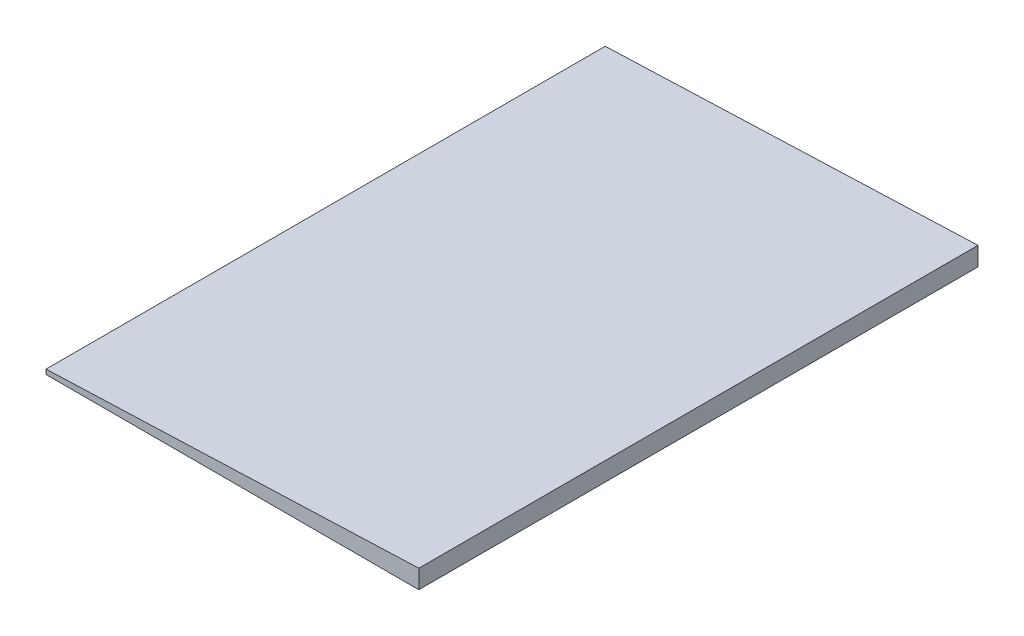
ISO-10303-21;
HEADER;
FILE_DESCRIPTION(('STEP AP214'),'2;1');
FILE_NAME('part.step','',(''),(''),'','','');
FILE_SCHEMA(('AUTOMOTIVE_DESIGN { 1 0 10303 214 1 1 1 1 }'));
ENDSEC;
DATA;
#1=APPLICATION_CONTEXT('core data for automotive mechanical design processes');
#2=APPLICATION_PROTOCOL_DEFINITION('international standard','automotive_design',2000,#1);
#3=PRODUCT_CONTEXT('',#1,'mechanical');
#4=PRODUCT('Part','Part','',(#3));
#5=PRODUCT_RELATED_PRODUCT_CATEGORY('part','',(#4));
#6=PRODUCT_DEFINITION_FORMATION('','',#4);
#7=PRODUCT_DEFINITION_CONTEXT('part definition',#1,'design');
#8=PRODUCT_DEFINITION('design','',#6,#7);
#9=PRODUCT_DEFINITION_SHAPE('','',#8);
#10=(LENGTH_UNIT() NAMED_UNIT(*) SI_UNIT(.MILLI.,.METRE.));
#11=(NAMED_UNIT(*) PLANE_ANGLE_UNIT() SI_UNIT($,.RADIAN.));
#12=(NAMED_UNIT(*) SI_UNIT($,.STERADIAN.) SOLID_ANGLE_UNIT());
#13=UNCERTAINTY_MEASURE_WITH_UNIT(LENGTH_MEASURE(1.E-05),#10,'distance_accuracy_value','');
#14=(GEOMETRIC_REPRESENTATION_CONTEXT(3) GLOBAL_UNCERTAINTY_ASSIGNED_CONTEXT((#13)) GLOBAL_UNIT_ASSIGNED_CONTEXT((#10,
#11,#12)) REPRESENTATION_CONTEXT('',''));
#15=CARTESIAN_POINT('',(0.,0.,0.));
#16=DIRECTION('',(0.,0.,1.));
#17=DIRECTION('',(1.,0.,0.));
#18=AXIS2_PLACEMENT_3D('',#15,#16,#17);
#19=CARTESIAN_POINT('',(-52.5,4.,-60.));
#20=DIRECTION('',(0.,0.,1.));
#21=DIRECTION('',(1.,0.,0.));
#22=AXIS2_PLACEMENT_3D('',#19,#20,#21);
#23=PLANE('',#22);
#24=DIRECTION('',(0.,-1.,0.));
#25=VECTOR('',#24,1.);
#26=CARTESIAN_POINT('',(-52.5,4.,-60.));
#27=LINE('',#26,#25);
#28=CARTESIAN_POINT('',(-52.5,1.,-60.));
#29=VERTEX_POINT('',#28);
#30=CARTESIAN_POINT('',(-52.5,0.,-60.));
#31=VERTEX_POINT('',#30);
#32=EDGE_CURVE('E44',#29,#31,#27,.T.);
#33=ORIENTED_EDGE('',*,*,#32,.F.);
#34=DIRECTION('',(0.999297615709181,0.0374736605890942,0.));
#35=VECTOR('',#34,1.);
#36=CARTESIAN_POINT('',(-52.3876579809643,1.00421282571384,-60.));
#37=LINE('',#36,#35);
#38=CARTESIAN_POINT('',(27.5,4.,-60.));
#39=VERTEX_POINT('',#38);
#40=EDGE_CURVE('E144',#29,#39,#37,.T.);
#41=ORIENTED_EDGE('',*,*,#40,.T.);
#42=DIRECTION('',(0.,-1.,0.));
#43=VECTOR('',#42,1.);
#44=CARTESIAN_POINT('',(27.5,4.,-60.));
#45=LINE('',#44,#43);
#46=CARTESIAN_POINT('',(27.5,0.,-60.));
#47=VERTEX_POINT('',#46);
#48=EDGE_CURVE('E150',#39,#47,#45,.T.);
#49=ORIENTED_EDGE('',*,*,#48,.T.);
#50=DIRECTION('',(-1.,0.,0.));
#51=VECTOR('',#50,1.);
#52=CARTESIAN_POINT('',(-52.5,0.,-60.));
#53=LINE('',#52,#51);
#54=EDGE_CURVE('E153',#47,#31,#53,.T.);
#55=ORIENTED_EDGE('',*,*,#54,.T.);
#56=EDGE_LOOP('',(#33,#41,#49,#55));
#57=FACE_BOUND('',#56,.T.);
#58=ADVANCED_FACE('F37',(#57),#23,.F.);
#59=CARTESIAN_POINT('',(-52.5,4.,-60.));
#60=DIRECTION('',(1.,0.,0.));
#61=DIRECTION('',(0.,0.,-1.));
#62=AXIS2_PLACEMENT_3D('',#59,#60,#61);
#63=PLANE('',#62);
#64=DIRECTION('',(0.,-1.,0.));
#65=VECTOR('',#64,1.);
#66=CARTESIAN_POINT('',(-52.5,4.,60.));
#67=LINE('',#66,#65);
#68=CARTESIAN_POINT('',(-52.5,1.,60.));
#69=VERTEX_POINT('',#68);
#70=CARTESIAN_POINT('',(-52.5,0.,60.));
#71=VERTEX_POINT('',#70);
#72=EDGE_CURVE('E162',#69,#71,#67,.T.);
#73=ORIENTED_EDGE('',*,*,#72,.F.);
#74=DIRECTION('',(0.,0.,1.));
#75=VECTOR('',#74,1.);
#76=CARTESIAN_POINT('',(-52.5,1.,-95.));
#77=LINE('',#76,#75);
#78=EDGE_CURVE('E142',#29,#69,#77,.T.);
#79=ORIENTED_EDGE('',*,*,#78,.F.);
#80=ORIENTED_EDGE('',*,*,#32,.T.);
#81=DIRECTION('',(0.,0.,1.));
#82=VECTOR('',#81,1.);
#83=CARTESIAN_POINT('',(-52.5,0.,-60.));
#84=LINE('',#83,#82);
#85=EDGE_CURVE('E156',#31,#71,#84,.T.);
#86=ORIENTED_EDGE('',*,*,#85,.T.);
#87=EDGE_LOOP('',(#73,#79,#80,#86));
#88=FACE_BOUND('',#87,.T.);
#89=ADVANCED_FACE('F167',(#88),#63,.F.);
#90=CARTESIAN_POINT('',(-52.5,4.,60.));
#91=DIRECTION('',(0.,0.,-1.));
#92=DIRECTION('',(-1.,0.,0.));
#93=AXIS2_PLACEMENT_3D('',#90,#91,#92);
#94=PLANE('',#93);
#95=DIRECTION('',(0.,-1.,0.));
#96=VECTOR('',#95,1.);
#97=CARTESIAN_POINT('',(27.5,4.,60.));
#98=LINE('',#97,#96);
#99=CARTESIAN_POINT('',(27.5,4.,60.));
#100=VERTEX_POINT('',#99);
#101=CARTESIAN_POINT('',(27.5,0.,60.));
#102=VERTEX_POINT('',#101);
#103=EDGE_CURVE('E59',#100,#102,#98,.T.);
#104=ORIENTED_EDGE('',*,*,#103,.F.);
#105=DIRECTION('',(0.999297615709181,0.0374736605890942,0.));
#106=VECTOR('',#105,1.);
#107=CARTESIAN_POINT('',(-0.111171789670775,2.96458105788734,60.));
#108=LINE('',#107,#106);
#109=EDGE_CURVE('E128',#69,#100,#108,.T.);
#110=ORIENTED_EDGE('',*,*,#109,.F.);
#111=ORIENTED_EDGE('',*,*,#72,.T.);
#112=DIRECTION('',(1.,0.,0.));
#113=VECTOR('',#112,1.);
#114=CARTESIAN_POINT('',(-52.5,0.,60.));
#115=LINE('',#114,#113);
#116=EDGE_CURVE('E159',#71,#102,#115,.T.);
#117=ORIENTED_EDGE('',*,*,#116,.T.);
#118=EDGE_LOOP('',(#104,#110,#111,#117));
#119=FACE_BOUND('',#118,.T.);
#120=ADVANCED_FACE('F176',(#119),#94,.F.);
#121=CARTESIAN_POINT('',(0.,0.,0.));
#122=DIRECTION('',(0.,1.,0.));
#123=DIRECTION('',(0.,0.,1.));
#124=AXIS2_PLACEMENT_3D('',#121,#122,#123);
#125=PLANE('',#124);
#126=DIRECTION('',(0.,0.,1.));
#127=VECTOR('',#126,1.);
#128=CARTESIAN_POINT('',(26.5,0.,0.));
#129=LINE('',#128,#127);
#130=CARTESIAN_POINT('',(26.5,0.,-59.));
#131=VERTEX_POINT('',#130);
#132=CARTESIAN_POINT('',(26.5,0.,59.));
#133=VERTEX_POINT('',#132);
#134=EDGE_CURVE('E124',#131,#133,#129,.T.);
#135=ORIENTED_EDGE('',*,*,#134,.F.);
#136=DIRECTION('',(-1.,0.,0.));
#137=VECTOR('',#136,1.);
#138=CARTESIAN_POINT('',(-52.5,0.,-59.));
#139=LINE('',#138,#137);
#140=CARTESIAN_POINT('',(-51.5,0.,-59.));
#141=VERTEX_POINT('',#140);
#142=EDGE_CURVE('E132',#131,#141,#139,.T.);
#143=ORIENTED_EDGE('',*,*,#142,.T.);
#144=DIRECTION('',(0.,0.,1.));
#145=VECTOR('',#144,1.);
#146=CARTESIAN_POINT('',(-51.5,0.,-60.));
#147=LINE('',#146,#145);
#148=CARTESIAN_POINT('',(-51.5,0.,59.));
#149=VERTEX_POINT('',#148);
#150=EDGE_CURVE('E122',#141,#149,#147,.T.);
#151=ORIENTED_EDGE('',*,*,#150,.T.);
#152=DIRECTION('',(1.,0.,0.));
#153=VECTOR('',#152,1.);
#154=CARTESIAN_POINT('',(-52.5,0.,59.));
#155=LINE('',#154,#153);
#156=EDGE_CURVE('E51',#149,#133,#155,.T.);
#157=ORIENTED_EDGE('',*,*,#156,.T.);
#158=EDGE_LOOP('',(#135,#143,#151,#157));
#159=FACE_BOUND('',#158,.T.);
#160=ORIENTED_EDGE('',*,*,#54,.F.);
#161=DIRECTION('',(0.,0.,1.));
#162=VECTOR('',#161,1.);
#163=CARTESIAN_POINT('',(27.5,0.,0.));
#164=LINE('',#163,#162);
#165=EDGE_CURVE('E11',#47,#102,#164,.T.);
#166=ORIENTED_EDGE('',*,*,#165,.T.);
#167=ORIENTED_EDGE('',*,*,#116,.F.);
#168=ORIENTED_EDGE('',*,*,#85,.F.);
#169=EDGE_LOOP('',(#160,#166,#167,#168));
#170=FACE_BOUND('',#169,.T.);
#171=ADVANCED_FACE('F174',(#159,#170),#125,.F.);
#172=CARTESIAN_POINT('',(27.5,4.,-95.));
#173=DIRECTION('',(-1.,0.,0.));
#174=DIRECTION('',(0.,0.,1.));
#175=AXIS2_PLACEMENT_3D('',#172,#173,#174);
#176=PLANE('',#175);
#177=DIRECTION('',(0.,0.,1.));
#178=VECTOR('',#177,1.);
#179=CARTESIAN_POINT('',(27.5,4.,-95.));
#180=LINE('',#179,#178);
#181=EDGE_CURVE('E148',#39,#100,#180,.T.);
#182=ORIENTED_EDGE('',*,*,#181,.T.);
#183=ORIENTED_EDGE('',*,*,#103,.T.);
#184=ORIENTED_EDGE('',*,*,#165,.F.);
#185=ORIENTED_EDGE('',*,*,#48,.F.);
#186=EDGE_LOOP('',(#182,#183,#184,#185));
#187=FACE_BOUND('',#186,.T.);
#188=ADVANCED_FACE('F180',(#187),#176,.F.);
#189=CARTESIAN_POINT('',(-0.111171789670775,2.96458105788734,-95.));
#190=DIRECTION('',(0.0374736605890942,-0.999297615709181,0.));
#191=DIRECTION('',(0.999297615709181,0.0374736605890942,0.));
#192=AXIS2_PLACEMENT_3D('',#189,#190,#191);
#193=PLANE('',#192);
#194=ORIENTED_EDGE('',*,*,#78,.T.);
#195=ORIENTED_EDGE('',*,*,#109,.T.);
#196=ORIENTED_EDGE('',*,*,#181,.F.);
#197=ORIENTED_EDGE('',*,*,#40,.F.);
#198=EDGE_LOOP('',(#194,#195,#196,#197));
#199=FACE_BOUND('',#198,.T.);
#200=ADVANCED_FACE('F179',(#199),#193,.F.);
#201=CARTESIAN_POINT('',(-52.5,4.,-59.));
#202=DIRECTION('',(0.,0.,1.));
#203=DIRECTION('',(1.,0.,0.));
#204=AXIS2_PLACEMENT_3D('',#201,#202,#203);
#205=PLANE('',#204);
#206=DIRECTION('',(0.,-1.,0.));
#207=VECTOR('',#206,1.);
#208=CARTESIAN_POINT('',(-51.5,4.,-59.));
#209=LINE('',#208,#207);
#210=CARTESIAN_POINT('',(-51.5,0.0367971220187268,-59.));
#211=VERTEX_POINT('',#210);
#212=EDGE_CURVE('E107',#211,#141,#209,.T.);
#213=ORIENTED_EDGE('',*,*,#212,.T.);
#214=ORIENTED_EDGE('',*,*,#142,.F.);
#215=DIRECTION('',(0.,-1.,0.));
#216=VECTOR('',#215,1.);
#217=CARTESIAN_POINT('',(26.5,4.,-59.));
#218=LINE('',#217,#216);
#219=CARTESIAN_POINT('',(26.5,2.96179712201872,-59.));
#220=VERTEX_POINT('',#219);
#221=EDGE_CURVE('E109',#220,#131,#218,.T.);
#222=ORIENTED_EDGE('',*,*,#221,.F.);
#223=DIRECTION('',(0.999297615709181,0.0374736605890942,0.));
#224=VECTOR('',#223,1.);
#225=CARTESIAN_POINT('',(-52.3501843203752,0.00491521000465893,-59.));
#226=LINE('',#225,#224);
#227=EDGE_CURVE('E102',#211,#220,#226,.T.);
#228=ORIENTED_EDGE('',*,*,#227,.F.);
#229=EDGE_LOOP('',(#213,#214,#222,#228));
#230=FACE_BOUND('',#229,.T.);
#231=ADVANCED_FACE('F104',(#230),#205,.T.);
#232=CARTESIAN_POINT('',(-51.5,4.,-60.));
#233=DIRECTION('',(1.,0.,0.));
#234=DIRECTION('',(0.,0.,-1.));
#235=AXIS2_PLACEMENT_3D('',#232,#233,#234);
#236=PLANE('',#235);
#237=DIRECTION('',(0.,-1.,0.));
#238=VECTOR('',#237,1.);
#239=CARTESIAN_POINT('',(-51.5,4.,59.));
#240=LINE('',#239,#238);
#241=CARTESIAN_POINT('',(-51.5,0.0367971220187278,59.));
#242=VERTEX_POINT('',#241);
#243=EDGE_CURVE('E125',#242,#149,#240,.T.);
#244=ORIENTED_EDGE('',*,*,#243,.T.);
#245=ORIENTED_EDGE('',*,*,#150,.F.);
#246=ORIENTED_EDGE('',*,*,#212,.F.);
#247=DIRECTION('',(0.,0.,1.));
#248=VECTOR('',#247,1.);
#249=CARTESIAN_POINT('',(-51.5,0.0367971220187264,-95.));
#250=LINE('',#249,#248);
#251=EDGE_CURVE('E113',#211,#242,#250,.T.);
#252=ORIENTED_EDGE('',*,*,#251,.T.);
#253=EDGE_LOOP('',(#244,#245,#246,#252));
#254=FACE_BOUND('',#253,.T.);
#255=ADVANCED_FACE('F120',(#254),#236,.T.);
#256=CARTESIAN_POINT('',(-52.5,4.,59.));
#257=DIRECTION('',(0.,0.,-1.));
#258=DIRECTION('',(-1.,0.,0.));
#259=AXIS2_PLACEMENT_3D('',#256,#257,#258);
#260=PLANE('',#259);
#261=DIRECTION('',(0.,-1.,0.));
#262=VECTOR('',#261,1.);
#263=CARTESIAN_POINT('',(26.5,4.,59.));
#264=LINE('',#263,#262);
#265=CARTESIAN_POINT('',(26.5,2.96179712201872,59.));
#266=VERTEX_POINT('',#265);
#267=EDGE_CURVE('E112',#266,#133,#264,.T.);
#268=ORIENTED_EDGE('',*,*,#267,.T.);
#269=ORIENTED_EDGE('',*,*,#156,.F.);
#270=ORIENTED_EDGE('',*,*,#243,.F.);
#271=DIRECTION('',(0.999297615709181,0.0374736605890942,0.));
#272=VECTOR('',#271,1.);
#273=CARTESIAN_POINT('',(-0.073698129081681,1.96528344217816,59.));
#274=LINE('',#273,#272);
#275=EDGE_CURVE('E117',#242,#266,#274,.T.);
#276=ORIENTED_EDGE('',*,*,#275,.T.);
#277=EDGE_LOOP('',(#268,#269,#270,#276));
#278=FACE_BOUND('',#277,.T.);
#279=ADVANCED_FACE('F227',(#278),#260,.T.);
#280=CARTESIAN_POINT('',(26.5,4.,-95.));
#281=DIRECTION('',(-1.,0.,0.));
#282=DIRECTION('',(0.,0.,1.));
#283=AXIS2_PLACEMENT_3D('',#280,#281,#282);
#284=PLANE('',#283);
#285=DIRECTION('',(0.,0.,1.));
#286=VECTOR('',#285,1.);
#287=CARTESIAN_POINT('',(26.5,2.96179712201873,-95.));
#288=LINE('',#287,#286);
#289=EDGE_CURVE('E133',#220,#266,#288,.T.);
#290=ORIENTED_EDGE('',*,*,#289,.F.);
#291=ORIENTED_EDGE('',*,*,#221,.T.);
#292=ORIENTED_EDGE('',*,*,#134,.T.);
#293=ORIENTED_EDGE('',*,*,#267,.F.);
#294=EDGE_LOOP('',(#290,#291,#292,#293));
#295=FACE_BOUND('',#294,.T.);
#296=ADVANCED_FACE('F237',(#295),#284,.T.);
#297=CARTESIAN_POINT('',(-0.073698129081681,1.96528344217816,-95.));
#298=DIRECTION('',(0.0374736605890942,-0.999297615709181,0.));
#299=DIRECTION('',(0.999297615709181,0.0374736605890942,0.));
#300=AXIS2_PLACEMENT_3D('',#297,#298,#299);
#301=PLANE('',#300);
#302=ORIENTED_EDGE('',*,*,#251,.F.);
#303=ORIENTED_EDGE('',*,*,#227,.T.);
#304=ORIENTED_EDGE('',*,*,#289,.T.);
#305=ORIENTED_EDGE('',*,*,#275,.F.);
#306=EDGE_LOOP('',(#302,#303,#304,#305));
#307=FACE_BOUND('',#306,.T.);
#308=ADVANCED_FACE('F116',(#307),#301,.T.);
#309=CLOSED_SHELL('',(#58,#89,#120,#171,#188,#200,#231,#255,#279,#296,#308));
#310=MANIFOLD_SOLID_BREP('B2',#309);
#311=ADVANCED_BREP_SHAPE_REPRESENTATION('',(#18,#310),#14);
#312=SHAPE_DEFINITION_REPRESENTATION(#9,#311);
ENDSEC;
END-ISO-10303-21;
